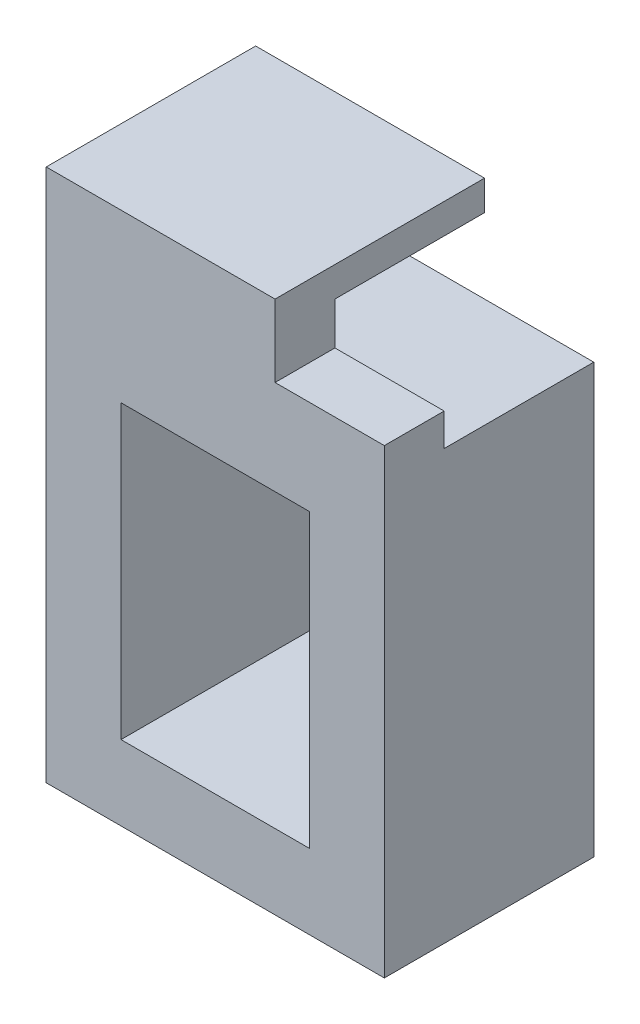
ISO-10303-21;
HEADER;
FILE_DESCRIPTION(('STEP AP214'),'2;1');
FILE_NAME('part.step','',(''),(''),'','','');
FILE_SCHEMA(('AUTOMOTIVE_DESIGN { 1 0 10303 214 1 1 1 1 }'));
ENDSEC;
DATA;
#1=APPLICATION_CONTEXT('core data for automotive mechanical design processes');
#2=APPLICATION_PROTOCOL_DEFINITION('international standard','automotive_design',2000,#1);
#3=PRODUCT_CONTEXT('',#1,'mechanical');
#4=PRODUCT('Part','Part','',(#3));
#5=PRODUCT_RELATED_PRODUCT_CATEGORY('part','',(#4));
#6=PRODUCT_DEFINITION_FORMATION('','',#4);
#7=PRODUCT_DEFINITION_CONTEXT('part definition',#1,'design');
#8=PRODUCT_DEFINITION('design','',#6,#7);
#9=PRODUCT_DEFINITION_SHAPE('','',#8);
#10=(LENGTH_UNIT() NAMED_UNIT(*) SI_UNIT(.MILLI.,.METRE.));
#11=(NAMED_UNIT(*) PLANE_ANGLE_UNIT() SI_UNIT($,.RADIAN.));
#12=(NAMED_UNIT(*) SI_UNIT($,.STERADIAN.) SOLID_ANGLE_UNIT());
#13=UNCERTAINTY_MEASURE_WITH_UNIT(LENGTH_MEASURE(1.E-05),#10,'distance_accuracy_value','');
#14=(GEOMETRIC_REPRESENTATION_CONTEXT(3) GLOBAL_UNCERTAINTY_ASSIGNED_CONTEXT((#13)) GLOBAL_UNIT_ASSIGNED_CONTEXT((#10,
#11,#12)) REPRESENTATION_CONTEXT('',''));
#15=CARTESIAN_POINT('',(0.,0.,0.));
#16=DIRECTION('',(0.,0.,1.));
#17=DIRECTION('',(1.,0.,0.));
#18=AXIS2_PLACEMENT_3D('',#15,#16,#17);
#19=CARTESIAN_POINT('',(0.,0.,10.));
#20=DIRECTION('',(0.,0.,-1.));
#21=DIRECTION('',(-1.,0.,0.));
#22=AXIS2_PLACEMENT_3D('',#19,#20,#21);
#23=PLANE('',#22);
#24=DIRECTION('',(0.,1.,0.));
#25=VECTOR('',#24,1.);
#26=CARTESIAN_POINT('',(3.99697053106252,0.,10.));
#27=LINE('',#26,#25);
#28=CARTESIAN_POINT('',(3.99697053106252,16.0700531603846,10.));
#29=VERTEX_POINT('',#28);
#30=CARTESIAN_POINT('',(3.99697053106252,18.9,9.99999999999999));
#31=VERTEX_POINT('',#30);
#32=EDGE_CURVE('E162',#29,#31,#27,.T.);
#33=ORIENTED_EDGE('',*,*,#32,.F.);
#34=DIRECTION('',(-1.,0.,0.));
#35=VECTOR('',#34,1.);
#36=CARTESIAN_POINT('',(0.,16.0700531603846,10.));
#37=LINE('',#36,#35);
#38=CARTESIAN_POINT('',(11.3,16.0700531603846,10.));
#39=VERTEX_POINT('',#38);
#40=EDGE_CURVE('E142',#39,#29,#37,.T.);
#41=ORIENTED_EDGE('',*,*,#40,.F.);
#42=DIRECTION('',(0.,1.,0.));
#43=VECTOR('',#42,1.);
#44=CARTESIAN_POINT('',(11.3,20.9,10.));
#45=LINE('',#44,#43);
#46=CARTESIAN_POINT('',(11.3,13.9,10.));
#47=VERTEX_POINT('',#46);
#48=EDGE_CURVE('E57',#47,#39,#45,.T.);
#49=ORIENTED_EDGE('',*,*,#48,.F.);
#50=DIRECTION('',(1.,0.,0.));
#51=VECTOR('',#50,1.);
#52=CARTESIAN_POINT('',(-11.3,13.9,10.));
#53=LINE('',#52,#51);
#54=CARTESIAN_POINT('',(-11.3,13.9,10.));
#55=VERTEX_POINT('',#54);
#56=EDGE_CURVE('E186',#55,#47,#53,.T.);
#57=ORIENTED_EDGE('',*,*,#56,.F.);
#58=DIRECTION('',(0.,-1.,0.));
#59=VECTOR('',#58,1.);
#60=CARTESIAN_POINT('',(-11.3,13.9,10.));
#61=LINE('',#60,#59);
#62=CARTESIAN_POINT('',(-11.3,18.9,10.));
#63=VERTEX_POINT('',#62);
#64=EDGE_CURVE('E189',#63,#55,#61,.T.);
#65=ORIENTED_EDGE('',*,*,#64,.F.);
#66=DIRECTION('',(-1.,0.,0.));
#67=VECTOR('',#66,1.);
#68=CARTESIAN_POINT('',(11.3,18.9,10.));
#69=LINE('',#68,#67);
#70=EDGE_CURVE('E167',#31,#63,#69,.T.);
#71=ORIENTED_EDGE('',*,*,#70,.F.);
#72=EDGE_LOOP('',(#33,#41,#49,#57,#65,#71));
#73=FACE_BOUND('',#72,.T.);
#74=ADVANCED_FACE('F35',(#73),#23,.T.);
#75=CARTESIAN_POINT('',(0.,13.9,14.));
#76=DIRECTION('',(0.,1.,0.));
#77=DIRECTION('',(0.,0.,1.));
#78=AXIS2_PLACEMENT_3D('',#75,#76,#77);
#79=PLANE('',#78);
#80=DIRECTION('',(0.,0.,-1.));
#81=VECTOR('',#80,1.);
#82=CARTESIAN_POINT('',(-11.3,13.9,14.));
#83=LINE('',#82,#81);
#84=CARTESIAN_POINT('',(-11.3,13.9,0.));
#85=VERTEX_POINT('',#84);
#86=EDGE_CURVE('E243',#55,#85,#83,.T.);
#87=ORIENTED_EDGE('',*,*,#86,.F.);
#88=ORIENTED_EDGE('',*,*,#56,.T.);
#89=DIRECTION('',(0.,0.,-1.));
#90=VECTOR('',#89,1.);
#91=CARTESIAN_POINT('',(11.3,13.9,14.));
#92=LINE('',#91,#90);
#93=CARTESIAN_POINT('',(11.3,13.9,0.));
#94=VERTEX_POINT('',#93);
#95=EDGE_CURVE('E252',#47,#94,#92,.T.);
#96=ORIENTED_EDGE('',*,*,#95,.T.);
#97=DIRECTION('',(1.,0.,0.));
#98=VECTOR('',#97,1.);
#99=CARTESIAN_POINT('',(0.,13.9,0.));
#100=LINE('',#99,#98);
#101=EDGE_CURVE('E236',#85,#94,#100,.T.);
#102=ORIENTED_EDGE('',*,*,#101,.F.);
#103=EDGE_LOOP('',(#87,#88,#96,#102));
#104=FACE_BOUND('',#103,.T.);
#105=ADVANCED_FACE('F270',(#104),#79,.T.);
#106=CARTESIAN_POINT('',(0.,-14.75,14.));
#107=DIRECTION('',(0.,1.,0.));
#108=DIRECTION('',(0.,0.,1.));
#109=AXIS2_PLACEMENT_3D('',#106,#107,#108);
#110=PLANE('',#109);
#111=DIRECTION('',(1.,0.,0.));
#112=VECTOR('',#111,1.);
#113=CARTESIAN_POINT('',(0.,-14.75,0.));
#114=LINE('',#113,#112);
#115=CARTESIAN_POINT('',(-11.3,-14.75,0.));
#116=VERTEX_POINT('',#115);
#117=CARTESIAN_POINT('',(11.3,-14.75,0.));
#118=VERTEX_POINT('',#117);
#119=EDGE_CURVE('E230',#116,#118,#114,.T.);
#120=ORIENTED_EDGE('',*,*,#119,.T.);
#121=DIRECTION('',(0.,0.,-1.));
#122=VECTOR('',#121,1.);
#123=CARTESIAN_POINT('',(11.3,-14.75,14.));
#124=LINE('',#123,#122);
#125=CARTESIAN_POINT('',(11.3,-14.75,14.));
#126=VERTEX_POINT('',#125);
#127=EDGE_CURVE('E43',#126,#118,#124,.T.);
#128=ORIENTED_EDGE('',*,*,#127,.F.);
#129=DIRECTION('',(1.,0.,0.));
#130=VECTOR('',#129,1.);
#131=CARTESIAN_POINT('',(0.,-14.75,14.));
#132=LINE('',#131,#130);
#133=CARTESIAN_POINT('',(-11.3,-14.75,14.));
#134=VERTEX_POINT('',#133);
#135=EDGE_CURVE('E212',#134,#126,#132,.T.);
#136=ORIENTED_EDGE('',*,*,#135,.F.);
#137=DIRECTION('',(0.,0.,-1.));
#138=VECTOR('',#137,1.);
#139=CARTESIAN_POINT('',(-11.3,-14.75,14.));
#140=LINE('',#139,#138);
#141=EDGE_CURVE('E240',#134,#116,#140,.T.);
#142=ORIENTED_EDGE('',*,*,#141,.T.);
#143=EDGE_LOOP('',(#120,#128,#136,#142));
#144=FACE_BOUND('',#143,.T.);
#145=ADVANCED_FACE('F278',(#144),#110,.F.);
#146=CARTESIAN_POINT('',(11.3,0.,14.));
#147=DIRECTION('',(-1.,0.,0.));
#148=DIRECTION('',(0.,0.,1.));
#149=AXIS2_PLACEMENT_3D('',#146,#147,#148);
#150=PLANE('',#149);
#151=ORIENTED_EDGE('',*,*,#48,.T.);
#152=DIRECTION('',(0.,0.,1.));
#153=VECTOR('',#152,1.);
#154=CARTESIAN_POINT('',(11.3,16.0700531603846,14.));
#155=LINE('',#154,#153);
#156=CARTESIAN_POINT('',(11.3,16.0700531603846,14.));
#157=VERTEX_POINT('',#156);
#158=EDGE_CURVE('E164',#39,#157,#155,.T.);
#159=ORIENTED_EDGE('',*,*,#158,.T.);
#160=DIRECTION('',(0.,1.,0.));
#161=VECTOR('',#160,1.);
#162=CARTESIAN_POINT('',(11.3,0.,14.));
#163=LINE('',#162,#161);
#164=EDGE_CURVE('E157',#126,#157,#163,.T.);
#165=ORIENTED_EDGE('',*,*,#164,.F.);
#166=ORIENTED_EDGE('',*,*,#127,.T.);
#167=DIRECTION('',(0.,1.,0.));
#168=VECTOR('',#167,1.);
#169=CARTESIAN_POINT('',(11.3,0.,0.));
#170=LINE('',#169,#168);
#171=EDGE_CURVE('E233',#118,#94,#170,.T.);
#172=ORIENTED_EDGE('',*,*,#171,.T.);
#173=ORIENTED_EDGE('',*,*,#95,.F.);
#174=EDGE_LOOP('',(#151,#159,#165,#166,#172,#173));
#175=FACE_BOUND('',#174,.T.);
#176=ADVANCED_FACE('F327',(#175),#150,.F.);
#177=CARTESIAN_POINT('',(0.,9.75,14.));
#178=DIRECTION('',(0.,1.,0.));
#179=DIRECTION('',(0.,0.,1.));
#180=AXIS2_PLACEMENT_3D('',#177,#178,#179);
#181=PLANE('',#180);
#182=DIRECTION('',(1.,0.,0.));
#183=VECTOR('',#182,1.);
#184=CARTESIAN_POINT('',(0.,9.75,0.));
#185=LINE('',#184,#183);
#186=CARTESIAN_POINT('',(-6.3,9.75,0.));
#187=VERTEX_POINT('',#186);
#188=CARTESIAN_POINT('',(6.3,9.75,0.));
#189=VERTEX_POINT('',#188);
#190=EDGE_CURVE('E218',#187,#189,#185,.T.);
#191=ORIENTED_EDGE('',*,*,#190,.T.);
#192=DIRECTION('',(0.,0.,-1.));
#193=VECTOR('',#192,1.);
#194=CARTESIAN_POINT('',(6.3,9.75,14.));
#195=LINE('',#194,#193);
#196=CARTESIAN_POINT('',(6.3,9.75,14.));
#197=VERTEX_POINT('',#196);
#198=EDGE_CURVE('E244',#197,#189,#195,.T.);
#199=ORIENTED_EDGE('',*,*,#198,.F.);
#200=DIRECTION('',(1.,0.,0.));
#201=VECTOR('',#200,1.);
#202=CARTESIAN_POINT('',(0.,9.75,14.));
#203=LINE('',#202,#201);
#204=CARTESIAN_POINT('',(-6.3,9.75,14.));
#205=VERTEX_POINT('',#204);
#206=EDGE_CURVE('E200',#205,#197,#203,.T.);
#207=ORIENTED_EDGE('',*,*,#206,.F.);
#208=DIRECTION('',(0.,0.,-1.));
#209=VECTOR('',#208,1.);
#210=CARTESIAN_POINT('',(-6.3,9.75,14.));
#211=LINE('',#210,#209);
#212=EDGE_CURVE('E217',#205,#187,#211,.T.);
#213=ORIENTED_EDGE('',*,*,#212,.T.);
#214=EDGE_LOOP('',(#191,#199,#207,#213));
#215=FACE_BOUND('',#214,.T.);
#216=ADVANCED_FACE('F37',(#215),#181,.F.);
#217=CARTESIAN_POINT('',(6.3,0.,14.));
#218=DIRECTION('',(1.,0.,0.));
#219=DIRECTION('',(0.,1.,0.));
#220=AXIS2_PLACEMENT_3D('',#217,#218,#219);
#221=PLANE('',#220);
#222=DIRECTION('',(0.,-1.,0.));
#223=VECTOR('',#222,1.);
#224=CARTESIAN_POINT('',(6.3,0.,0.));
#225=LINE('',#224,#223);
#226=CARTESIAN_POINT('',(6.3,-9.75,0.));
#227=VERTEX_POINT('',#226);
#228=EDGE_CURVE('E221',#189,#227,#225,.T.);
#229=ORIENTED_EDGE('',*,*,#228,.T.);
#230=DIRECTION('',(0.,0.,-1.));
#231=VECTOR('',#230,1.);
#232=CARTESIAN_POINT('',(6.3,-9.75,14.));
#233=LINE('',#232,#231);
#234=CARTESIAN_POINT('',(6.3,-9.75,14.));
#235=VERTEX_POINT('',#234);
#236=EDGE_CURVE('E282',#235,#227,#233,.T.);
#237=ORIENTED_EDGE('',*,*,#236,.F.);
#238=DIRECTION('',(0.,-1.,0.));
#239=VECTOR('',#238,1.);
#240=CARTESIAN_POINT('',(6.3,0.,14.));
#241=LINE('',#240,#239);
#242=EDGE_CURVE('E203',#197,#235,#241,.T.);
#243=ORIENTED_EDGE('',*,*,#242,.F.);
#244=ORIENTED_EDGE('',*,*,#198,.T.);
#245=EDGE_LOOP('',(#229,#237,#243,#244));
#246=FACE_BOUND('',#245,.T.);
#247=ADVANCED_FACE('F289',(#246),#221,.F.);
#248=CARTESIAN_POINT('',(0.,-9.75,14.));
#249=DIRECTION('',(0.,1.,0.));
#250=DIRECTION('',(0.,0.,1.));
#251=AXIS2_PLACEMENT_3D('',#248,#249,#250);
#252=PLANE('',#251);
#253=DIRECTION('',(1.,0.,0.));
#254=VECTOR('',#253,1.);
#255=CARTESIAN_POINT('',(0.,-9.75,0.));
#256=LINE('',#255,#254);
#257=CARTESIAN_POINT('',(-6.3,-9.75,0.));
#258=VERTEX_POINT('',#257);
#259=EDGE_CURVE('E224',#258,#227,#256,.T.);
#260=ORIENTED_EDGE('',*,*,#259,.F.);
#261=DIRECTION('',(0.,0.,-1.));
#262=VECTOR('',#261,1.);
#263=CARTESIAN_POINT('',(-6.3,-9.75,14.));
#264=LINE('',#263,#262);
#265=CARTESIAN_POINT('',(-6.3,-9.75,14.));
#266=VERTEX_POINT('',#265);
#267=EDGE_CURVE('E281',#266,#258,#264,.T.);
#268=ORIENTED_EDGE('',*,*,#267,.F.);
#269=DIRECTION('',(1.,0.,0.));
#270=VECTOR('',#269,1.);
#271=CARTESIAN_POINT('',(0.,-9.75,14.));
#272=LINE('',#271,#270);
#273=EDGE_CURVE('E206',#266,#235,#272,.T.);
#274=ORIENTED_EDGE('',*,*,#273,.T.);
#275=ORIENTED_EDGE('',*,*,#236,.T.);
#276=EDGE_LOOP('',(#260,#268,#274,#275));
#277=FACE_BOUND('',#276,.T.);
#278=ADVANCED_FACE('F299',(#277),#252,.T.);
#279=CARTESIAN_POINT('',(-6.3,0.,14.));
#280=DIRECTION('',(1.,0.,0.));
#281=DIRECTION('',(0.,1.,0.));
#282=AXIS2_PLACEMENT_3D('',#279,#280,#281);
#283=PLANE('',#282);
#284=DIRECTION('',(0.,-1.,0.));
#285=VECTOR('',#284,1.);
#286=CARTESIAN_POINT('',(-6.3,0.,0.));
#287=LINE('',#286,#285);
#288=EDGE_CURVE('E227',#187,#258,#287,.T.);
#289=ORIENTED_EDGE('',*,*,#288,.F.);
#290=ORIENTED_EDGE('',*,*,#212,.F.);
#291=DIRECTION('',(0.,-1.,0.));
#292=VECTOR('',#291,1.);
#293=CARTESIAN_POINT('',(-6.3,0.,14.));
#294=LINE('',#293,#292);
#295=EDGE_CURVE('E209',#205,#266,#294,.T.);
#296=ORIENTED_EDGE('',*,*,#295,.T.);
#297=ORIENTED_EDGE('',*,*,#267,.T.);
#298=EDGE_LOOP('',(#289,#290,#296,#297));
#299=FACE_BOUND('',#298,.T.);
#300=ADVANCED_FACE('F296',(#299),#283,.T.);
#301=CARTESIAN_POINT('',(-11.3,0.,14.));
#302=DIRECTION('',(1.,0.,0.));
#303=DIRECTION('',(0.,1.,0.));
#304=AXIS2_PLACEMENT_3D('',#301,#302,#303);
#305=PLANE('',#304);
#306=DIRECTION('',(0.,-1.,0.));
#307=VECTOR('',#306,1.);
#308=CARTESIAN_POINT('',(-11.3,0.,0.));
#309=LINE('',#308,#307);
#310=EDGE_CURVE('E204',#85,#116,#309,.T.);
#311=ORIENTED_EDGE('',*,*,#310,.T.);
#312=ORIENTED_EDGE('',*,*,#141,.F.);
#313=DIRECTION('',(0.,-1.,0.));
#314=VECTOR('',#313,1.);
#315=CARTESIAN_POINT('',(-11.3,0.,14.));
#316=LINE('',#315,#314);
#317=CARTESIAN_POINT('',(-11.3,20.9,14.));
#318=VERTEX_POINT('',#317);
#319=EDGE_CURVE('E215',#318,#134,#316,.T.);
#320=ORIENTED_EDGE('',*,*,#319,.F.);
#321=DIRECTION('',(0.,0.,-1.));
#322=VECTOR('',#321,1.);
#323=CARTESIAN_POINT('',(-11.3,20.9,37.6592476634402));
#324=LINE('',#323,#322);
#325=CARTESIAN_POINT('',(-11.3,20.9,0.));
#326=VERTEX_POINT('',#325);
#327=EDGE_CURVE('E175',#318,#326,#324,.T.);
#328=ORIENTED_EDGE('',*,*,#327,.T.);
#329=DIRECTION('',(0.,-1.,0.));
#330=VECTOR('',#329,1.);
#331=CARTESIAN_POINT('',(-11.3,18.9,0.));
#332=LINE('',#331,#330);
#333=CARTESIAN_POINT('',(-11.3,18.9,0.));
#334=VERTEX_POINT('',#333);
#335=EDGE_CURVE('E168',#326,#334,#332,.T.);
#336=ORIENTED_EDGE('',*,*,#335,.T.);
#337=DIRECTION('',(0.,0.,1.));
#338=VECTOR('',#337,1.);
#339=CARTESIAN_POINT('',(-11.3,18.9,-22.6883229878279));
#340=LINE('',#339,#338);
#341=EDGE_CURVE('E177',#334,#63,#340,.T.);
#342=ORIENTED_EDGE('',*,*,#341,.T.);
#343=ORIENTED_EDGE('',*,*,#64,.T.);
#344=ORIENTED_EDGE('',*,*,#86,.T.);
#345=EDGE_LOOP('',(#311,#312,#320,#328,#336,#342,#343,#344));
#346=FACE_BOUND('',#345,.T.);
#347=ADVANCED_FACE('F258',(#346),#305,.F.);
#348=CARTESIAN_POINT('',(0.,0.,14.));
#349=DIRECTION('',(0.,0.,1.));
#350=DIRECTION('',(1.,0.,0.));
#351=AXIS2_PLACEMENT_3D('',#348,#349,#350);
#352=PLANE('',#351);
#353=DIRECTION('',(0.,-1.,0.));
#354=VECTOR('',#353,1.);
#355=CARTESIAN_POINT('',(3.99697053106252,31.8222462075797,14.));
#356=LINE('',#355,#354);
#357=CARTESIAN_POINT('',(3.99697053106252,20.9,14.));
#358=VERTEX_POINT('',#357);
#359=CARTESIAN_POINT('',(3.99697053106252,16.0700531603846,14.));
#360=VERTEX_POINT('',#359);
#361=EDGE_CURVE('E146',#358,#360,#356,.T.);
#362=ORIENTED_EDGE('',*,*,#361,.F.);
#363=DIRECTION('',(-1.,0.,0.));
#364=VECTOR('',#363,1.);
#365=CARTESIAN_POINT('',(-11.3,20.9,14.));
#366=LINE('',#365,#364);
#367=EDGE_CURVE('E183',#358,#318,#366,.T.);
#368=ORIENTED_EDGE('',*,*,#367,.T.);
#369=ORIENTED_EDGE('',*,*,#319,.T.);
#370=ORIENTED_EDGE('',*,*,#135,.T.);
#371=ORIENTED_EDGE('',*,*,#164,.T.);
#372=DIRECTION('',(1.,0.,0.));
#373=VECTOR('',#372,1.);
#374=CARTESIAN_POINT('',(29.6840512450274,16.0700531603846,14.));
#375=LINE('',#374,#373);
#376=EDGE_CURVE('E140',#360,#157,#375,.T.);
#377=ORIENTED_EDGE('',*,*,#376,.F.);
#378=EDGE_LOOP('',(#362,#368,#369,#370,#371,#377));
#379=FACE_BOUND('',#378,.T.);
#380=ORIENTED_EDGE('',*,*,#206,.T.);
#381=ORIENTED_EDGE('',*,*,#242,.T.);
#382=ORIENTED_EDGE('',*,*,#273,.F.);
#383=ORIENTED_EDGE('',*,*,#295,.F.);
#384=EDGE_LOOP('',(#380,#381,#382,#383));
#385=FACE_BOUND('',#384,.T.);
#386=ADVANCED_FACE('F154',(#379,#385),#352,.T.);
#387=CARTESIAN_POINT('',(0.,0.,0.));
#388=DIRECTION('',(0.,0.,1.));
#389=DIRECTION('',(1.,0.,0.));
#390=AXIS2_PLACEMENT_3D('',#387,#388,#389);
#391=PLANE('',#390);
#392=ORIENTED_EDGE('',*,*,#190,.F.);
#393=ORIENTED_EDGE('',*,*,#288,.T.);
#394=ORIENTED_EDGE('',*,*,#259,.T.);
#395=ORIENTED_EDGE('',*,*,#228,.F.);
#396=EDGE_LOOP('',(#392,#393,#394,#395));
#397=FACE_BOUND('',#396,.T.);
#398=ORIENTED_EDGE('',*,*,#119,.F.);
#399=ORIENTED_EDGE('',*,*,#310,.F.);
#400=ORIENTED_EDGE('',*,*,#101,.T.);
#401=ORIENTED_EDGE('',*,*,#171,.F.);
#402=EDGE_LOOP('',(#398,#399,#400,#401));
#403=FACE_BOUND('',#402,.T.);
#404=ADVANCED_FACE('F274',(#397,#403),#391,.F.);
#405=CARTESIAN_POINT('',(-11.3,20.9,37.6592476634402));
#406=DIRECTION('',(0.,-1.,0.));
#407=DIRECTION('',(0.,0.,-1.));
#408=AXIS2_PLACEMENT_3D('',#405,#406,#407);
#409=PLANE('',#408);
#410=ORIENTED_EDGE('',*,*,#367,.F.);
#411=DIRECTION('',(0.,0.,-1.));
#412=VECTOR('',#411,1.);
#413=CARTESIAN_POINT('',(3.99697053106252,20.9,37.6592476634402));
#414=LINE('',#413,#412);
#415=CARTESIAN_POINT('',(3.99697053106252,20.9,0.));
#416=VERTEX_POINT('',#415);
#417=EDGE_CURVE('E149',#358,#416,#414,.T.);
#418=ORIENTED_EDGE('',*,*,#417,.T.);
#419=DIRECTION('',(-1.,0.,0.));
#420=VECTOR('',#419,1.);
#421=CARTESIAN_POINT('',(-11.3,20.9,0.));
#422=LINE('',#421,#420);
#423=EDGE_CURVE('E172',#416,#326,#422,.T.);
#424=ORIENTED_EDGE('',*,*,#423,.T.);
#425=ORIENTED_EDGE('',*,*,#327,.F.);
#426=EDGE_LOOP('',(#410,#418,#424,#425));
#427=FACE_BOUND('',#426,.T.);
#428=ADVANCED_FACE('F260',(#427),#409,.F.);
#429=CARTESIAN_POINT('',(11.3,18.9,-22.6883229878279));
#430=DIRECTION('',(0.,1.,0.));
#431=DIRECTION('',(0.,0.,1.));
#432=AXIS2_PLACEMENT_3D('',#429,#430,#431);
#433=PLANE('',#432);
#434=DIRECTION('',(1.,0.,0.));
#435=VECTOR('',#434,1.);
#436=CARTESIAN_POINT('',(11.3,18.9,0.));
#437=LINE('',#436,#435);
#438=CARTESIAN_POINT('',(3.99697053106252,18.9,0.));
#439=VERTEX_POINT('',#438);
#440=EDGE_CURVE('E171',#334,#439,#437,.T.);
#441=ORIENTED_EDGE('',*,*,#440,.T.);
#442=DIRECTION('',(0.,0.,1.));
#443=VECTOR('',#442,1.);
#444=CARTESIAN_POINT('',(3.99697053106252,18.9,-22.6883229878279));
#445=LINE('',#444,#443);
#446=EDGE_CURVE('E50',#439,#31,#445,.T.);
#447=ORIENTED_EDGE('',*,*,#446,.T.);
#448=ORIENTED_EDGE('',*,*,#70,.T.);
#449=ORIENTED_EDGE('',*,*,#341,.F.);
#450=EDGE_LOOP('',(#441,#447,#448,#449));
#451=FACE_BOUND('',#450,.T.);
#452=ADVANCED_FACE('F317',(#451),#433,.F.);
#453=CARTESIAN_POINT('',(0.,0.,0.));
#454=DIRECTION('',(0.,0.,1.));
#455=DIRECTION('',(1.,0.,0.));
#456=AXIS2_PLACEMENT_3D('',#453,#454,#455);
#457=PLANE('',#456);
#458=ORIENTED_EDGE('',*,*,#423,.F.);
#459=DIRECTION('',(0.,-1.,0.));
#460=VECTOR('',#459,1.);
#461=CARTESIAN_POINT('',(3.99697053106252,0.,0.));
#462=LINE('',#461,#460);
#463=EDGE_CURVE('E11',#416,#439,#462,.T.);
#464=ORIENTED_EDGE('',*,*,#463,.T.);
#465=ORIENTED_EDGE('',*,*,#440,.F.);
#466=ORIENTED_EDGE('',*,*,#335,.F.);
#467=EDGE_LOOP('',(#458,#464,#465,#466));
#468=FACE_BOUND('',#467,.T.);
#469=ADVANCED_FACE('F263',(#468),#457,.F.);
#470=CARTESIAN_POINT('',(3.99697053106252,31.8222462075797,-2.50000000007189E-05));
#471=DIRECTION('',(-1.,0.,0.));
#472=DIRECTION('',(0.,0.,1.));
#473=AXIS2_PLACEMENT_3D('',#470,#471,#472);
#474=PLANE('',#473);
#475=ORIENTED_EDGE('',*,*,#32,.T.);
#476=ORIENTED_EDGE('',*,*,#446,.F.);
#477=ORIENTED_EDGE('',*,*,#463,.F.);
#478=ORIENTED_EDGE('',*,*,#417,.F.);
#479=ORIENTED_EDGE('',*,*,#361,.T.);
#480=DIRECTION('',(0.,0.,1.));
#481=VECTOR('',#480,1.);
#482=CARTESIAN_POINT('',(3.99697053106252,16.0700531603846,-2.50000000007189E-05));
#483=LINE('',#482,#481);
#484=EDGE_CURVE('E136',#29,#360,#483,.T.);
#485=ORIENTED_EDGE('',*,*,#484,.F.);
#486=EDGE_LOOP('',(#475,#476,#477,#478,#479,#485));
#487=FACE_BOUND('',#486,.T.);
#488=ADVANCED_FACE('F147',(#487),#474,.F.);
#489=CARTESIAN_POINT('',(29.6840512450274,16.0700531603846,-2.50000000007189E-05));
#490=DIRECTION('',(0.,-1.,0.));
#491=DIRECTION('',(0.,0.,-1.));
#492=AXIS2_PLACEMENT_3D('',#489,#490,#491);
#493=PLANE('',#492);
#494=ORIENTED_EDGE('',*,*,#40,.T.);
#495=ORIENTED_EDGE('',*,*,#484,.T.);
#496=ORIENTED_EDGE('',*,*,#376,.T.);
#497=ORIENTED_EDGE('',*,*,#158,.F.);
#498=EDGE_LOOP('',(#494,#495,#496,#497));
#499=FACE_BOUND('',#498,.T.);
#500=ADVANCED_FACE('F138',(#499),#493,.F.);
#501=CLOSED_SHELL('',(#74,#105,#145,#176,#216,#247,#278,#300,#347,#386,#404,#428,#452,#469,#488,#500));
#502=MANIFOLD_SOLID_BREP('B2',#501);
#503=ADVANCED_BREP_SHAPE_REPRESENTATION('',(#18,#502),#14);
#504=SHAPE_DEFINITION_REPRESENTATION(#9,#503);
ENDSEC;
END-ISO-10303-21;
